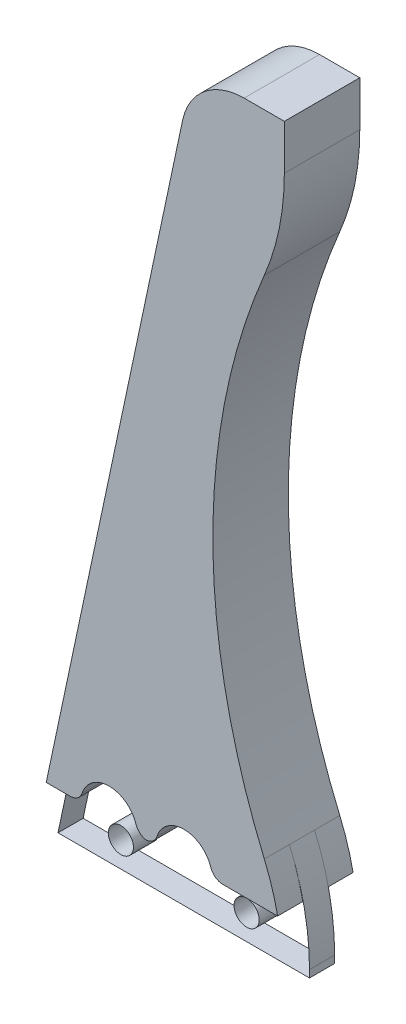
ISO-10303-21;
HEADER;
FILE_DESCRIPTION(('STEP AP214'),'2;1');
FILE_NAME('part.step','',(''),(''),'','','');
FILE_SCHEMA(('AUTOMOTIVE_DESIGN { 1 0 10303 214 1 1 1 1 }'));
ENDSEC;
DATA;
#1=APPLICATION_CONTEXT('core data for automotive mechanical design processes');
#2=APPLICATION_PROTOCOL_DEFINITION('international standard','automotive_design',2000,#1);
#3=PRODUCT_CONTEXT('',#1,'mechanical');
#4=PRODUCT('Part','Part','',(#3));
#5=PRODUCT_RELATED_PRODUCT_CATEGORY('part','',(#4));
#6=PRODUCT_DEFINITION_FORMATION('','',#4);
#7=PRODUCT_DEFINITION_CONTEXT('part definition',#1,'design');
#8=PRODUCT_DEFINITION('design','',#6,#7);
#9=PRODUCT_DEFINITION_SHAPE('','',#8);
#10=(LENGTH_UNIT() NAMED_UNIT(*) SI_UNIT(.MILLI.,.METRE.));
#11=(NAMED_UNIT(*) PLANE_ANGLE_UNIT() SI_UNIT($,.RADIAN.));
#12=(NAMED_UNIT(*) SI_UNIT($,.STERADIAN.) SOLID_ANGLE_UNIT());
#13=UNCERTAINTY_MEASURE_WITH_UNIT(LENGTH_MEASURE(1.E-05),#10,'distance_accuracy_value','');
#14=(GEOMETRIC_REPRESENTATION_CONTEXT(3) GLOBAL_UNCERTAINTY_ASSIGNED_CONTEXT((#13)) GLOBAL_UNIT_ASSIGNED_CONTEXT((#10,
#11,#12)) REPRESENTATION_CONTEXT('',''));
#15=CARTESIAN_POINT('',(0.,0.,0.));
#16=DIRECTION('',(0.,0.,1.));
#17=DIRECTION('',(1.,0.,0.));
#18=AXIS2_PLACEMENT_3D('',#15,#16,#17);
#19=CARTESIAN_POINT('',(1.06278280835009,5.,-2.));
#20=DIRECTION('',(0.,-1.,0.));
#21=DIRECTION('',(0.,0.,-1.));
#22=AXIS2_PLACEMENT_3D('',#19,#20,#21);
#23=PLANE('',#22);
#24=DIRECTION('',(1.,0.,0.));
#25=VECTOR('',#24,1.);
#26=CARTESIAN_POINT('',(1.06278280835009,5.,-2.));
#27=LINE('',#26,#25);
#28=CARTESIAN_POINT('',(1.06278280835009,5.,-2.));
#29=VERTEX_POINT('',#28);
#30=CARTESIAN_POINT('',(2.97045358913685,5.,-2.));
#31=VERTEX_POINT('',#30);
#32=EDGE_CURVE('E300',#29,#31,#27,.T.);
#33=ORIENTED_EDGE('',*,*,#32,.T.);
#34=DIRECTION('',(0.,0.,-1.));
#35=VECTOR('',#34,1.);
#36=CARTESIAN_POINT('',(2.97045358913685,5.,-2.));
#37=LINE('',#36,#35);
#38=CARTESIAN_POINT('',(2.97045358913685,5.,0.));
#39=VERTEX_POINT('',#38);
#40=EDGE_CURVE('E69',#31,#39,#37,.F.);
#41=ORIENTED_EDGE('',*,*,#40,.T.);
#42=DIRECTION('',(1.,0.,0.));
#43=VECTOR('',#42,1.);
#44=CARTESIAN_POINT('',(65.7262090119729,5.,0.));
#45=LINE('',#44,#43);
#46=CARTESIAN_POINT('',(1.06278280835009,5.,0.));
#47=VERTEX_POINT('',#46);
#48=EDGE_CURVE('E421',#47,#39,#45,.T.);
#49=ORIENTED_EDGE('',*,*,#48,.F.);
#50=DIRECTION('',(0.,0.,1.));
#51=VECTOR('',#50,1.);
#52=CARTESIAN_POINT('',(1.06278280835009,5.,-2.));
#53=LINE('',#52,#51);
#54=EDGE_CURVE('E243',#29,#47,#53,.T.);
#55=ORIENTED_EDGE('',*,*,#54,.F.);
#56=EDGE_LOOP('',(#33,#41,#49,#55));
#57=FACE_BOUND('',#56,.T.);
#58=ADVANCED_FACE('F45',(#57),#23,.T.);
#59=CARTESIAN_POINT('',(15.0851120275633,5.,0.));
#60=VERTEX_POINT('',#59);
#61=CARTESIAN_POINT('',(19.4673448233214,5.,0.));
#62=VERTEX_POINT('',#61);
#63=EDGE_CURVE('E420',#60,#62,#45,.T.);
#64=ORIENTED_EDGE('',*,*,#63,.F.);
#65=DIRECTION('',(0.,0.,-1.));
#66=VECTOR('',#65,1.);
#67=CARTESIAN_POINT('',(15.0851120275633,5.,-2.));
#68=LINE('',#67,#66);
#69=CARTESIAN_POINT('',(15.0851120275633,5.,-2.));
#70=VERTEX_POINT('',#69);
#71=EDGE_CURVE('E467',#60,#70,#68,.T.);
#72=ORIENTED_EDGE('',*,*,#71,.T.);
#73=CARTESIAN_POINT('',(19.4673448233214,5.,-2.));
#74=VERTEX_POINT('',#73);
#75=EDGE_CURVE('E299',#70,#74,#27,.T.);
#76=ORIENTED_EDGE('',*,*,#75,.T.);
#77=DIRECTION('',(0.,0.,1.));
#78=VECTOR('',#77,1.);
#79=CARTESIAN_POINT('',(19.4673448233214,5.,-2.));
#80=LINE('',#79,#78);
#81=EDGE_CURVE('E331',#74,#62,#80,.T.);
#82=ORIENTED_EDGE('',*,*,#81,.T.);
#83=EDGE_LOOP('',(#64,#72,#76,#82));
#84=FACE_BOUND('',#83,.T.);
#85=ADVANCED_FACE('F521',(#84),#23,.T.);
#86=DIRECTION('',(1.,0.,0.));
#87=VECTOR('',#86,1.);
#88=CARTESIAN_POINT('',(1.06278280835009,5.,4.));
#89=LINE('',#88,#87);
#90=CARTESIAN_POINT('',(15.1081120275633,5.,4.));
#91=VERTEX_POINT('',#90);
#92=CARTESIAN_POINT('',(19.4673448233214,5.,4.));
#93=VERTEX_POINT('',#92);
#94=EDGE_CURVE('E255',#91,#93,#89,.T.);
#95=ORIENTED_EDGE('',*,*,#94,.F.);
#96=DIRECTION('',(0.,0.,1.));
#97=VECTOR('',#96,1.);
#98=CARTESIAN_POINT('',(15.1081120275633,5.,-2.));
#99=LINE('',#98,#97);
#100=CARTESIAN_POINT('',(15.1081120275633,5.,2.));
#101=VERTEX_POINT('',#100);
#102=EDGE_CURVE('E444',#91,#101,#99,.F.);
#103=ORIENTED_EDGE('',*,*,#102,.T.);
#104=DIRECTION('',(1.,0.,0.));
#105=VECTOR('',#104,1.);
#106=CARTESIAN_POINT('',(65.7262090119729,5.,2.));
#107=LINE('',#106,#105);
#108=CARTESIAN_POINT('',(19.4673448233214,5.,2.));
#109=VERTEX_POINT('',#108);
#110=EDGE_CURVE('E345',#101,#109,#107,.T.);
#111=ORIENTED_EDGE('',*,*,#110,.T.);
#112=EDGE_CURVE('E334',#109,#93,#80,.T.);
#113=ORIENTED_EDGE('',*,*,#112,.T.);
#114=EDGE_LOOP('',(#95,#103,#111,#113));
#115=FACE_BOUND('',#114,.T.);
#116=ADVANCED_FACE('F617',(#115),#23,.T.);
#117=CARTESIAN_POINT('',(1.06278280835009,5.,2.));
#118=VERTEX_POINT('',#117);
#119=CARTESIAN_POINT('',(2.97045358913685,5.,2.));
#120=VERTEX_POINT('',#119);
#121=EDGE_CURVE('E346',#118,#120,#107,.T.);
#122=ORIENTED_EDGE('',*,*,#121,.T.);
#123=DIRECTION('',(0.,0.,1.));
#124=VECTOR('',#123,1.);
#125=CARTESIAN_POINT('',(2.97045358913685,5.,-2.));
#126=LINE('',#125,#124);
#127=CARTESIAN_POINT('',(2.97045358913685,5.,4.));
#128=VERTEX_POINT('',#127);
#129=EDGE_CURVE('E251',#120,#128,#126,.T.);
#130=ORIENTED_EDGE('',*,*,#129,.T.);
#131=CARTESIAN_POINT('',(1.06278280835009,5.,4.));
#132=VERTEX_POINT('',#131);
#133=EDGE_CURVE('E248',#132,#128,#89,.T.);
#134=ORIENTED_EDGE('',*,*,#133,.F.);
#135=EDGE_CURVE('E233',#118,#132,#53,.T.);
#136=ORIENTED_EDGE('',*,*,#135,.F.);
#137=EDGE_LOOP('',(#122,#130,#134,#136));
#138=FACE_BOUND('',#137,.T.);
#139=ADVANCED_FACE('F249',(#138),#23,.T.);
#140=CARTESIAN_POINT('',(0.,0.,2.));
#141=DIRECTION('',(0.978147600733806,-0.207911690817756,0.));
#142=DIRECTION('',(0.207911690817756,0.978147600733806,0.));
#143=AXIS2_PLACEMENT_3D('',#140,#141,#142);
#144=PLANE('',#143);
#145=DIRECTION('',(-0.207911690817756,-0.978147600733806,0.));
#146=VECTOR('',#145,1.);
#147=CARTESIAN_POINT('',(0.,0.,2.));
#148=LINE('',#147,#146);
#149=CARTESIAN_POINT('',(0.,0.,2.));
#150=VERTEX_POINT('',#149);
#151=EDGE_CURVE('E239',#118,#150,#148,.T.);
#152=ORIENTED_EDGE('',*,*,#151,.F.);
#153=ORIENTED_EDGE('',*,*,#135,.T.);
#154=DIRECTION('',(-0.207911690817756,-0.978147600733806,0.));
#155=VECTOR('',#154,1.);
#156=CARTESIAN_POINT('',(1.06278280835009,5.,4.));
#157=LINE('',#156,#155);
#158=CARTESIAN_POINT('',(11.9115758625071,56.0395584540888,4.));
#159=VERTEX_POINT('',#158);
#160=EDGE_CURVE('E237',#159,#132,#157,.T.);
#161=ORIENTED_EDGE('',*,*,#160,.F.);
#162=DIRECTION('',(0.,0.,-1.));
#163=VECTOR('',#162,1.);
#164=CARTESIAN_POINT('',(11.9115758625071,56.0395584540888,2.));
#165=LINE('',#164,#163);
#166=CARTESIAN_POINT('',(11.9115758625071,56.0395584540888,-2.));
#167=VERTEX_POINT('',#166);
#168=EDGE_CURVE('E395',#159,#167,#165,.T.);
#169=ORIENTED_EDGE('',*,*,#168,.T.);
#170=DIRECTION('',(-0.207911690817756,-0.978147600733806,0.));
#171=VECTOR('',#170,1.);
#172=CARTESIAN_POINT('',(1.06278280835009,5.,-2.));
#173=LINE('',#172,#171);
#174=EDGE_CURVE('E295',#167,#29,#173,.T.);
#175=ORIENTED_EDGE('',*,*,#174,.T.);
#176=ORIENTED_EDGE('',*,*,#54,.T.);
#177=DIRECTION('',(-0.207911690817756,-0.978147600733806,0.));
#178=VECTOR('',#177,1.);
#179=CARTESIAN_POINT('',(0.,0.,0.));
#180=LINE('',#179,#178);
#181=CARTESIAN_POINT('',(0.,0.,0.));
#182=VERTEX_POINT('',#181);
#183=EDGE_CURVE('E354',#47,#182,#180,.T.);
#184=ORIENTED_EDGE('',*,*,#183,.T.);
#185=DIRECTION('',(0.,0.,-1.));
#186=VECTOR('',#185,1.);
#187=CARTESIAN_POINT('',(0.,0.,2.));
#188=LINE('',#187,#186);
#189=EDGE_CURVE('E391',#150,#182,#188,.T.);
#190=ORIENTED_EDGE('',*,*,#189,.F.);
#191=EDGE_LOOP('',(#152,#153,#161,#169,#175,#176,#184,#190));
#192=FACE_BOUND('',#191,.T.);
#193=ADVANCED_FACE('F235',(#192),#144,.F.);
#194=CARTESIAN_POINT('',(0.,0.,2.));
#195=DIRECTION('',(0.,1.,0.));
#196=DIRECTION('',(0.,0.,1.));
#197=AXIS2_PLACEMENT_3D('',#194,#195,#196);
#198=PLANE('',#197);
#199=DIRECTION('',(1.,0.,0.));
#200=VECTOR('',#199,1.);
#201=CARTESIAN_POINT('',(0.,0.,0.));
#202=LINE('',#201,#200);
#203=CARTESIAN_POINT('',(20.,0.,0.));
#204=VERTEX_POINT('',#203);
#205=EDGE_CURVE('E379',#182,#204,#202,.T.);
#206=ORIENTED_EDGE('',*,*,#205,.T.);
#207=DIRECTION('',(0.,0.,-1.));
#208=VECTOR('',#207,1.);
#209=CARTESIAN_POINT('',(20.,0.,2.));
#210=LINE('',#209,#208);
#211=CARTESIAN_POINT('',(20.,0.,2.));
#212=VERTEX_POINT('',#211);
#213=EDGE_CURVE('E387',#212,#204,#210,.T.);
#214=ORIENTED_EDGE('',*,*,#213,.F.);
#215=DIRECTION('',(1.,0.,0.));
#216=VECTOR('',#215,1.);
#217=CARTESIAN_POINT('',(0.,0.,2.));
#218=LINE('',#217,#216);
#219=EDGE_CURVE('E368',#150,#212,#218,.T.);
#220=ORIENTED_EDGE('',*,*,#219,.F.);
#221=ORIENTED_EDGE('',*,*,#189,.T.);
#222=EDGE_LOOP('',(#206,#214,#220,#221));
#223=FACE_BOUND('',#222,.T.);
#224=ADVANCED_FACE('F554',(#223),#198,.F.);
#225=CARTESIAN_POINT('',(20.,0.,2.));
#226=DIRECTION('',(-1.,0.,0.));
#227=DIRECTION('',(0.,0.,1.));
#228=AXIS2_PLACEMENT_3D('',#225,#226,#227);
#229=PLANE('',#228);
#230=DIRECTION('',(0.,1.,0.));
#231=VECTOR('',#230,1.);
#232=CARTESIAN_POINT('',(20.,0.,0.));
#233=LINE('',#232,#231);
#234=CARTESIAN_POINT('',(20.,0.577620976898365,0.));
#235=VERTEX_POINT('',#234);
#236=EDGE_CURVE('E369',#204,#235,#233,.T.);
#237=ORIENTED_EDGE('',*,*,#236,.T.);
#238=DIRECTION('',(0.,0.,-1.));
#239=VECTOR('',#238,1.);
#240=CARTESIAN_POINT('',(20.,0.577620976898365,2.));
#241=LINE('',#240,#239);
#242=CARTESIAN_POINT('',(20.,0.577620976898365,2.));
#243=VERTEX_POINT('',#242);
#244=EDGE_CURVE('E414',#235,#243,#241,.F.);
#245=ORIENTED_EDGE('',*,*,#244,.T.);
#246=DIRECTION('',(0.,1.,0.));
#247=VECTOR('',#246,1.);
#248=CARTESIAN_POINT('',(20.,0.,2.));
#249=LINE('',#248,#247);
#250=EDGE_CURVE('E372',#212,#243,#249,.T.);
#251=ORIENTED_EDGE('',*,*,#250,.F.);
#252=ORIENTED_EDGE('',*,*,#213,.T.);
#253=EDGE_LOOP('',(#237,#245,#251,#252));
#254=FACE_BOUND('',#253,.T.);
#255=ADVANCED_FACE('F546',(#254),#229,.F.);
#256=CARTESIAN_POINT('',(65.7262090119729,28.5,2.));
#257=DIRECTION('',(0.,0.,-1.));
#258=DIRECTION('',(-1.,0.,0.));
#259=AXIS2_PLACEMENT_3D('',#256,#257,#258);
#260=CYLINDRICAL_SURFACE('',#259,51.4114402697166);
#261=DIRECTION('',(0.,0.,-1.));
#262=VECTOR('',#261,1.);
#263=CARTESIAN_POINT('',(18.4077533694123,48.6022373433818,2.));
#264=LINE('',#263,#262);
#265=CARTESIAN_POINT('',(18.4077533694123,48.6022373433818,-2.));
#266=VERTEX_POINT('',#265);
#267=CARTESIAN_POINT('',(18.4077533694123,48.6022373433818,4.));
#268=VERTEX_POINT('',#267);
#269=EDGE_CURVE('E404',#266,#268,#264,.F.);
#270=ORIENTED_EDGE('',*,*,#269,.T.);
#271=CARTESIAN_POINT('',(65.7262090119732,28.5,4.));
#272=DIRECTION('',(0.,0.,-1.));
#273=DIRECTION('',(1.,0.,0.));
#274=AXIS2_PLACEMENT_3D('',#271,#272,#273);
#275=CIRCLE('',#274,51.4114402697168);
#276=CARTESIAN_POINT('',(18.4077533694123,8.39776265661819,4.));
#277=VERTEX_POINT('',#276);
#278=EDGE_CURVE('E278',#277,#268,#275,.T.);
#279=ORIENTED_EDGE('',*,*,#278,.F.);
#280=DIRECTION('',(0.,0.,1.));
#281=VECTOR('',#280,1.);
#282=CARTESIAN_POINT('',(18.4077533694123,8.39776265661819,-2.));
#283=LINE('',#282,#281);
#284=CARTESIAN_POINT('',(18.4077533694123,8.39776265661818,2.));
#285=VERTEX_POINT('',#284);
#286=EDGE_CURVE('E330',#285,#277,#283,.T.);
#287=ORIENTED_EDGE('',*,*,#286,.F.);
#288=DIRECTION('',(0.,0.,-1.));
#289=VECTOR('',#288,1.);
#290=CARTESIAN_POINT('',(18.4077533694123,8.39776265661818,2.));
#291=LINE('',#290,#289);
#292=CARTESIAN_POINT('',(18.4077533694123,8.39776265661819,0.));
#293=VERTEX_POINT('',#292);
#294=EDGE_CURVE('E407',#285,#293,#291,.T.);
#295=ORIENTED_EDGE('',*,*,#294,.T.);
#296=CARTESIAN_POINT('',(18.4077533694123,8.39776265661819,-2.));
#297=VERTEX_POINT('',#296);
#298=EDGE_CURVE('E326',#297,#293,#283,.T.);
#299=ORIENTED_EDGE('',*,*,#298,.F.);
#300=CARTESIAN_POINT('',(65.7262090119732,28.5,-2.));
#301=DIRECTION('',(0.,0.,-1.));
#302=DIRECTION('',(1.,0.,0.));
#303=AXIS2_PLACEMENT_3D('',#300,#301,#302);
#304=CIRCLE('',#303,51.4114402697168);
#305=EDGE_CURVE('E307',#297,#266,#304,.T.);
#306=ORIENTED_EDGE('',*,*,#305,.T.);
#307=EDGE_LOOP('',(#270,#279,#287,#295,#299,#306));
#308=FACE_BOUND('',#307,.T.);
#309=ADVANCED_FACE('F533',(#308),#260,.F.);
#310=CARTESIAN_POINT('',(20.,60.,2.));
#311=DIRECTION('',(-1.,0.,0.));
#312=DIRECTION('',(0.,-1.,0.));
#313=AXIS2_PLACEMENT_3D('',#310,#311,#312);
#314=PLANE('',#313);
#315=DIRECTION('',(0.,0.,-1.));
#316=VECTOR('',#315,1.);
#317=CARTESIAN_POINT('',(20.,60.,2.));
#318=LINE('',#317,#316);
#319=CARTESIAN_POINT('',(20.,60.,4.));
#320=VERTEX_POINT('',#319);
#321=CARTESIAN_POINT('',(20.,60.,-2.));
#322=VERTEX_POINT('',#321);
#323=EDGE_CURVE('E376',#320,#322,#318,.T.);
#324=ORIENTED_EDGE('',*,*,#323,.F.);
#325=DIRECTION('',(0.,1.,0.));
#326=VECTOR('',#325,1.);
#327=CARTESIAN_POINT('',(20.,60.,4.));
#328=LINE('',#327,#326);
#329=CARTESIAN_POINT('',(20.,56.4223790231016,4.));
#330=VERTEX_POINT('',#329);
#331=EDGE_CURVE('E286',#330,#320,#328,.T.);
#332=ORIENTED_EDGE('',*,*,#331,.F.);
#333=DIRECTION('',(0.,0.,-1.));
#334=VECTOR('',#333,1.);
#335=CARTESIAN_POINT('',(20.,56.4223790231016,2.));
#336=LINE('',#335,#334);
#337=CARTESIAN_POINT('',(20.,56.4223790231016,-2.));
#338=VERTEX_POINT('',#337);
#339=EDGE_CURVE('E401',#330,#338,#336,.T.);
#340=ORIENTED_EDGE('',*,*,#339,.T.);
#341=DIRECTION('',(0.,1.,0.));
#342=VECTOR('',#341,1.);
#343=CARTESIAN_POINT('',(20.,60.,-2.));
#344=LINE('',#343,#342);
#345=EDGE_CURVE('E315',#338,#322,#344,.T.);
#346=ORIENTED_EDGE('',*,*,#345,.T.);
#347=EDGE_LOOP('',(#324,#332,#340,#346));
#348=FACE_BOUND('',#347,.T.);
#349=ADVANCED_FACE('F627',(#348),#314,.F.);
#350=CARTESIAN_POINT('',(12.7533937002011,60.,2.));
#351=DIRECTION('',(0.,-1.,0.));
#352=DIRECTION('',(0.,0.,-1.));
#353=AXIS2_PLACEMENT_3D('',#350,#351,#352);
#354=PLANE('',#353);
#355=ORIENTED_EDGE('',*,*,#323,.T.);
#356=DIRECTION('',(-1.,0.,0.));
#357=VECTOR('',#356,1.);
#358=CARTESIAN_POINT('',(16.8023138661762,60.,-2.));
#359=LINE('',#358,#357);
#360=CARTESIAN_POINT('',(16.8023138661762,60.,-2.));
#361=VERTEX_POINT('',#360);
#362=EDGE_CURVE('E319',#322,#361,#359,.T.);
#363=ORIENTED_EDGE('',*,*,#362,.T.);
#364=DIRECTION('',(0.,0.,-1.));
#365=VECTOR('',#364,1.);
#366=CARTESIAN_POINT('',(16.8023138661762,60.,2.));
#367=LINE('',#366,#365);
#368=CARTESIAN_POINT('',(16.8023138661762,60.,4.));
#369=VERTEX_POINT('',#368);
#370=EDGE_CURVE('E398',#361,#369,#367,.F.);
#371=ORIENTED_EDGE('',*,*,#370,.T.);
#372=DIRECTION('',(-1.,0.,0.));
#373=VECTOR('',#372,1.);
#374=CARTESIAN_POINT('',(16.8023138661762,60.,4.));
#375=LINE('',#374,#373);
#376=EDGE_CURVE('E290',#320,#369,#375,.T.);
#377=ORIENTED_EDGE('',*,*,#376,.F.);
#378=EDGE_LOOP('',(#355,#363,#371,#377));
#379=FACE_BOUND('',#378,.T.);
#380=ADVANCED_FACE('F630',(#379),#354,.F.);
#381=CARTESIAN_POINT('',(65.7262090119729,28.5,2.));
#382=DIRECTION('',(0.,0.,1.));
#383=DIRECTION('',(1.,0.,0.));
#384=AXIS2_PLACEMENT_3D('',#381,#382,#383);
#385=PLANE('',#384);
#386=CARTESIAN_POINT('',(1.90823451446642,1.38829373863014,2.));
#387=DIRECTION('',(0.,0.,1.));
#388=DIRECTION('',(1.,0.,0.));
#389=AXIS2_PLACEMENT_3D('',#386,#387,#388);
#390=CIRCLE('',#389,17.9267056917035);
#391=EDGE_CURVE('E341',#109,#285,#390,.T.);
#392=ORIENTED_EDGE('',*,*,#391,.F.);
#393=ORIENTED_EDGE('',*,*,#110,.F.);
#394=CARTESIAN_POINT('',(15.1081120275633,6.,2.));
#395=DIRECTION('',(0.,0.,1.));
#396=DIRECTION('',(1.,0.,0.));
#397=AXIS2_PLACEMENT_3D('',#394,#395,#396);
#398=CIRCLE('',#397,1.);
#399=CARTESIAN_POINT('',(14.1566261139593,5.69230769230769,2.));
#400=VERTEX_POINT('',#399);
#401=EDGE_CURVE('E455',#101,#400,#398,.F.);
#402=ORIENTED_EDGE('',*,*,#401,.T.);
#403=CARTESIAN_POINT('',(12.0157828083501,5.,2.));
#404=DIRECTION('',(0.,0.,-1.));
#405=DIRECTION('',(-1.,0.,0.));
#406=AXIS2_PLACEMENT_3D('',#403,#404,#405);
#407=CIRCLE('',#406,2.25);
#408=CARTESIAN_POINT('',(9.87493950274092,5.69230769230769,2.));
#409=VERTEX_POINT('',#408);
#410=EDGE_CURVE('E264',#409,#400,#407,.T.);
#411=ORIENTED_EDGE('',*,*,#410,.F.);
#412=CARTESIAN_POINT('',(8.92345358913685,6.,2.));
#413=DIRECTION('',(0.,0.,1.));
#414=DIRECTION('',(1.,0.,0.));
#415=AXIS2_PLACEMENT_3D('',#412,#413,#414);
#416=CIRCLE('',#415,1.);
#417=CARTESIAN_POINT('',(9.03928280835009,5.00673085622453,2.));
#418=VERTEX_POINT('',#417);
#419=EDGE_CURVE('E461',#409,#418,#416,.F.);
#420=ORIENTED_EDGE('',*,*,#419,.T.);
#421=CARTESIAN_POINT('',(9.15511202756334,6.,2.));
#422=DIRECTION('',(0.,0.,1.));
#423=DIRECTION('',(1.,0.,0.));
#424=AXIS2_PLACEMENT_3D('',#421,#422,#423);
#425=CIRCLE('',#424,1.);
#426=CARTESIAN_POINT('',(8.20362611395926,5.69230769230769,2.));
#427=VERTEX_POINT('',#426);
#428=EDGE_CURVE('E464',#418,#427,#425,.F.);
#429=ORIENTED_EDGE('',*,*,#428,.T.);
#430=CARTESIAN_POINT('',(6.06278280835009,5.,2.));
#431=DIRECTION('',(0.,0.,-1.));
#432=DIRECTION('',(-1.,0.,0.));
#433=AXIS2_PLACEMENT_3D('',#430,#431,#432);
#434=CIRCLE('',#433,2.25);
#435=CARTESIAN_POINT('',(3.92193950274092,5.69230769230769,2.));
#436=VERTEX_POINT('',#435);
#437=EDGE_CURVE('E272',#436,#427,#434,.T.);
#438=ORIENTED_EDGE('',*,*,#437,.F.);
#439=CARTESIAN_POINT('',(2.97045358913685,6.,2.));
#440=DIRECTION('',(0.,0.,1.));
#441=DIRECTION('',(1.,0.,0.));
#442=AXIS2_PLACEMENT_3D('',#439,#440,#441);
#443=CIRCLE('',#442,1.);
#444=EDGE_CURVE('E458',#436,#120,#443,.F.);
#445=ORIENTED_EDGE('',*,*,#444,.T.);
#446=ORIENTED_EDGE('',*,*,#121,.F.);
#447=ORIENTED_EDGE('',*,*,#151,.T.);
#448=ORIENTED_EDGE('',*,*,#219,.T.);
#449=ORIENTED_EDGE('',*,*,#250,.T.);
#450=CARTESIAN_POINT('',(0.,0.577620976898365,2.));
#451=DIRECTION('',(0.,0.,1.));
#452=DIRECTION('',(1.,0.,0.));
#453=AXIS2_PLACEMENT_3D('',#450,#451,#452);
#454=CIRCLE('',#453,20.);
#455=EDGE_CURVE('E417',#243,#285,#454,.T.);
#456=ORIENTED_EDGE('',*,*,#455,.T.);
#457=EDGE_LOOP('',(#392,#393,#402,#411,#420,#429,#438,#445,#446,#447,#448,#449,#456));
#458=FACE_BOUND('',#457,.T.);
#459=CARTESIAN_POINT('',(5.,2.,2.));
#460=DIRECTION('',(0.,0.,1.));
#461=DIRECTION('',(1.,0.,0.));
#462=AXIS2_PLACEMENT_3D('',#459,#460,#461);
#463=CIRCLE('',#462,1.);
#464=CARTESIAN_POINT('',(6.,2.,2.));
#465=VERTEX_POINT('',#464);
#466=EDGE_CURVE('E355',#465,#465,#463,.T.);
#467=ORIENTED_EDGE('',*,*,#466,.F.);
#468=EDGE_LOOP('',(#467));
#469=FACE_BOUND('',#468,.T.);
#470=CARTESIAN_POINT('',(15.,2.,2.));
#471=DIRECTION('',(0.,0.,1.));
#472=DIRECTION('',(1.,0.,0.));
#473=AXIS2_PLACEMENT_3D('',#470,#471,#472);
#474=CIRCLE('',#473,1.);
#475=CARTESIAN_POINT('',(16.,2.,2.));
#476=VERTEX_POINT('',#475);
#477=EDGE_CURVE('E359',#476,#476,#474,.T.);
#478=ORIENTED_EDGE('',*,*,#477,.F.);
#479=EDGE_LOOP('',(#478));
#480=FACE_BOUND('',#479,.T.);
#481=ADVANCED_FACE('F549',(#458,#469,#480),#385,.T.);
#482=CARTESIAN_POINT('',(65.7262090119729,28.5,0.));
#483=DIRECTION('',(0.,0.,1.));
#484=DIRECTION('',(1.,0.,0.));
#485=AXIS2_PLACEMENT_3D('',#482,#483,#484);
#486=PLANE('',#485);
#487=CARTESIAN_POINT('',(5.,2.,0.));
#488=DIRECTION('',(0.,0.,1.));
#489=DIRECTION('',(1.,0.,0.));
#490=AXIS2_PLACEMENT_3D('',#487,#488,#489);
#491=CIRCLE('',#490,1.);
#492=CARTESIAN_POINT('',(6.,2.,0.));
#493=VERTEX_POINT('',#492);
#494=EDGE_CURVE('E350',#493,#493,#491,.T.);
#495=ORIENTED_EDGE('',*,*,#494,.T.);
#496=EDGE_LOOP('',(#495));
#497=FACE_BOUND('',#496,.T.);
#498=CARTESIAN_POINT('',(15.,2.,0.));
#499=DIRECTION('',(0.,0.,1.));
#500=DIRECTION('',(1.,0.,0.));
#501=AXIS2_PLACEMENT_3D('',#498,#499,#500);
#502=CIRCLE('',#501,1.);
#503=CARTESIAN_POINT('',(16.,2.,0.));
#504=VERTEX_POINT('',#503);
#505=EDGE_CURVE('E349',#504,#504,#502,.T.);
#506=ORIENTED_EDGE('',*,*,#505,.T.);
#507=EDGE_LOOP('',(#506));
#508=FACE_BOUND('',#507,.T.);
#509=ORIENTED_EDGE('',*,*,#48,.T.);
#510=CARTESIAN_POINT('',(2.97045358913685,6.,0.));
#511=DIRECTION('',(0.,0.,1.));
#512=DIRECTION('',(1.,0.,0.));
#513=AXIS2_PLACEMENT_3D('',#510,#511,#512);
#514=CIRCLE('',#513,1.);
#515=CARTESIAN_POINT('',(3.92193950274092,5.69230769230769,0.));
#516=VERTEX_POINT('',#515);
#517=EDGE_CURVE('E11',#39,#516,#514,.T.);
#518=ORIENTED_EDGE('',*,*,#517,.T.);
#519=CARTESIAN_POINT('',(6.06278280835009,5.,0.));
#520=DIRECTION('',(0.,0.,1.));
#521=DIRECTION('',(1.,0.,0.));
#522=AXIS2_PLACEMENT_3D('',#519,#520,#521);
#523=CIRCLE('',#522,2.25);
#524=CARTESIAN_POINT('',(8.20362611395926,5.69230769230769,0.));
#525=VERTEX_POINT('',#524);
#526=EDGE_CURVE('E472',#525,#516,#523,.T.);
#527=ORIENTED_EDGE('',*,*,#526,.F.);
#528=CARTESIAN_POINT('',(9.15511202756334,6.,0.));
#529=DIRECTION('',(0.,0.,1.));
#530=DIRECTION('',(1.,0.,0.));
#531=AXIS2_PLACEMENT_3D('',#528,#529,#530);
#532=CIRCLE('',#531,1.);
#533=CARTESIAN_POINT('',(9.0277828083501,5.00813949068705,0.));
#534=VERTEX_POINT('',#533);
#535=EDGE_CURVE('E55',#525,#534,#532,.T.);
#536=ORIENTED_EDGE('',*,*,#535,.T.);
#537=CARTESIAN_POINT('',(8.90045358913686,6.,0.));
#538=DIRECTION('',(0.,0.,1.));
#539=DIRECTION('',(1.,0.,0.));
#540=AXIS2_PLACEMENT_3D('',#537,#538,#539);
#541=CIRCLE('',#540,1.);
#542=CARTESIAN_POINT('',(9.85193950274093,5.69230769230768,0.));
#543=VERTEX_POINT('',#542);
#544=EDGE_CURVE('E507',#534,#543,#541,.T.);
#545=ORIENTED_EDGE('',*,*,#544,.T.);
#546=CARTESIAN_POINT('',(11.9927828083501,4.99999999999996,0.));
#547=DIRECTION('',(0.,0.,1.));
#548=DIRECTION('',(1.,0.,0.));
#549=AXIS2_PLACEMENT_3D('',#546,#547,#548);
#550=CIRCLE('',#549,2.25);
#551=CARTESIAN_POINT('',(14.1336261139593,5.69230769230768,0.));
#552=VERTEX_POINT('',#551);
#553=EDGE_CURVE('E579',#552,#543,#550,.T.);
#554=ORIENTED_EDGE('',*,*,#553,.F.);
#555=CARTESIAN_POINT('',(15.0851120275633,6.,0.));
#556=DIRECTION('',(0.,0.,1.));
#557=DIRECTION('',(1.,0.,0.));
#558=AXIS2_PLACEMENT_3D('',#555,#556,#557);
#559=CIRCLE('',#558,1.);
#560=EDGE_CURVE('E504',#552,#60,#559,.T.);
#561=ORIENTED_EDGE('',*,*,#560,.T.);
#562=ORIENTED_EDGE('',*,*,#63,.T.);
#563=CARTESIAN_POINT('',(1.90823451446642,1.38829373863014,0.));
#564=DIRECTION('',(0.,0.,1.));
#565=DIRECTION('',(1.,0.,0.));
#566=AXIS2_PLACEMENT_3D('',#563,#564,#565);
#567=CIRCLE('',#566,17.9267056917035);
#568=EDGE_CURVE('E329',#62,#293,#567,.T.);
#569=ORIENTED_EDGE('',*,*,#568,.T.);
#570=CARTESIAN_POINT('',(0.,0.577620976898365,0.));
#571=DIRECTION('',(0.,0.,1.));
#572=DIRECTION('',(1.,0.,0.));
#573=AXIS2_PLACEMENT_3D('',#570,#571,#572);
#574=CIRCLE('',#573,20.);
#575=EDGE_CURVE('E411',#293,#235,#574,.F.);
#576=ORIENTED_EDGE('',*,*,#575,.T.);
#577=ORIENTED_EDGE('',*,*,#236,.F.);
#578=ORIENTED_EDGE('',*,*,#205,.F.);
#579=ORIENTED_EDGE('',*,*,#183,.F.);
#580=EDGE_LOOP('',(#509,#518,#527,#536,#545,#554,#561,#562,#569,#576,#577,#578,#579));
#581=FACE_BOUND('',#580,.T.);
#582=ADVANCED_FACE('F538',(#497,#508,#581),#486,.F.);
#583=CARTESIAN_POINT('',(16.8023138661762,55.,2.));
#584=DIRECTION('',(0.,0.,-1.));
#585=DIRECTION('',(-1.,0.,0.));
#586=AXIS2_PLACEMENT_3D('',#583,#584,#585);
#587=CYLINDRICAL_SURFACE('',#586,5.);
#588=ORIENTED_EDGE('',*,*,#168,.F.);
#589=CARTESIAN_POINT('',(16.8023138661762,55.,4.));
#590=DIRECTION('',(0.,0.,1.));
#591=DIRECTION('',(-1.,0.,0.));
#592=AXIS2_PLACEMENT_3D('',#589,#590,#591);
#593=CIRCLE('',#592,5.);
#594=EDGE_CURVE('E262',#369,#159,#593,.T.);
#595=ORIENTED_EDGE('',*,*,#594,.F.);
#596=ORIENTED_EDGE('',*,*,#370,.F.);
#597=CARTESIAN_POINT('',(16.8023138661762,55.,-2.));
#598=DIRECTION('',(0.,0.,1.));
#599=DIRECTION('',(-1.,0.,0.));
#600=AXIS2_PLACEMENT_3D('',#597,#598,#599);
#601=CIRCLE('',#600,5.);
#602=EDGE_CURVE('E244',#361,#167,#601,.T.);
#603=ORIENTED_EDGE('',*,*,#602,.T.);
#604=EDGE_LOOP('',(#588,#595,#596,#603));
#605=FACE_BOUND('',#604,.T.);
#606=ADVANCED_FACE('F633',(#605),#587,.T.);
#607=CARTESIAN_POINT('',(0.,56.4223790231016,2.));
#608=DIRECTION('',(0.,0.,-1.));
#609=DIRECTION('',(-1.,0.,0.));
#610=AXIS2_PLACEMENT_3D('',#607,#608,#609);
#611=CYLINDRICAL_SURFACE('',#610,20.);
#612=ORIENTED_EDGE('',*,*,#339,.F.);
#613=CARTESIAN_POINT('',(-6.17561557447743E-13,56.4223790231017,4.));
#614=DIRECTION('',(0.,0.,1.));
#615=DIRECTION('',(-1.,0.,0.));
#616=AXIS2_PLACEMENT_3D('',#613,#614,#615);
#617=CIRCLE('',#616,20.0000000000006);
#618=EDGE_CURVE('E282',#268,#330,#617,.T.);
#619=ORIENTED_EDGE('',*,*,#618,.F.);
#620=ORIENTED_EDGE('',*,*,#269,.F.);
#621=CARTESIAN_POINT('',(-6.17561557447743E-13,56.4223790231017,-2.));
#622=DIRECTION('',(0.,0.,1.));
#623=DIRECTION('',(-1.,0.,0.));
#624=AXIS2_PLACEMENT_3D('',#621,#622,#623);
#625=CIRCLE('',#624,20.0000000000006);
#626=EDGE_CURVE('E311',#266,#338,#625,.T.);
#627=ORIENTED_EDGE('',*,*,#626,.T.);
#628=EDGE_LOOP('',(#612,#619,#620,#627));
#629=FACE_BOUND('',#628,.T.);
#630=ADVANCED_FACE('F625',(#629),#611,.T.);
#631=CARTESIAN_POINT('',(0.,0.577620976898365,2.));
#632=DIRECTION('',(0.,0.,-1.));
#633=DIRECTION('',(-1.,0.,0.));
#634=AXIS2_PLACEMENT_3D('',#631,#632,#633);
#635=CYLINDRICAL_SURFACE('',#634,20.);
#636=ORIENTED_EDGE('',*,*,#455,.F.);
#637=ORIENTED_EDGE('',*,*,#244,.F.);
#638=ORIENTED_EDGE('',*,*,#575,.F.);
#639=ORIENTED_EDGE('',*,*,#294,.F.);
#640=EDGE_LOOP('',(#636,#637,#638,#639));
#641=FACE_BOUND('',#640,.T.);
#642=ADVANCED_FACE('F543',(#641),#635,.T.);
#643=CARTESIAN_POINT('',(15.,2.,0.));
#644=DIRECTION('',(0.,0.,1.));
#645=DIRECTION('',(1.,0.,0.));
#646=AXIS2_PLACEMENT_3D('',#643,#644,#645);
#647=CYLINDRICAL_SURFACE('',#646,1.);
#648=ORIENTED_EDGE('',*,*,#505,.F.);
#649=EDGE_LOOP('',(#648));
#650=FACE_BOUND('',#649,.T.);
#651=ORIENTED_EDGE('',*,*,#477,.T.);
#652=EDGE_LOOP('',(#651));
#653=FACE_BOUND('',#652,.T.);
#654=ADVANCED_FACE('F676',(#650,#653),#647,.F.);
#655=CARTESIAN_POINT('',(5.,2.,0.));
#656=DIRECTION('',(0.,0.,1.));
#657=DIRECTION('',(1.,0.,0.));
#658=AXIS2_PLACEMENT_3D('',#655,#656,#657);
#659=CYLINDRICAL_SURFACE('',#658,1.);
#660=ORIENTED_EDGE('',*,*,#494,.F.);
#661=EDGE_LOOP('',(#660));
#662=FACE_BOUND('',#661,.T.);
#663=ORIENTED_EDGE('',*,*,#466,.T.);
#664=EDGE_LOOP('',(#663));
#665=FACE_BOUND('',#664,.T.);
#666=ADVANCED_FACE('F678',(#662,#665),#659,.F.);
#667=CARTESIAN_POINT('',(16.8023138661762,55.,-2.));
#668=DIRECTION('',(0.,0.,-1.));
#669=DIRECTION('',(-1.,0.,0.));
#670=AXIS2_PLACEMENT_3D('',#667,#668,#669);
#671=PLANE('',#670);
#672=ORIENTED_EDGE('',*,*,#75,.F.);
#673=CARTESIAN_POINT('',(15.0851120275633,6.,-2.));
#674=DIRECTION('',(0.,0.,-1.));
#675=DIRECTION('',(-1.,0.,0.));
#676=AXIS2_PLACEMENT_3D('',#673,#674,#675);
#677=CIRCLE('',#676,1.);
#678=CARTESIAN_POINT('',(14.1336261139593,5.69230769230768,-2.));
#679=VERTEX_POINT('',#678);
#680=EDGE_CURVE('E485',#70,#679,#677,.T.);
#681=ORIENTED_EDGE('',*,*,#680,.T.);
#682=CARTESIAN_POINT('',(11.9927828083501,4.99999999999996,-2.));
#683=DIRECTION('',(0.,0.,1.));
#684=DIRECTION('',(1.,0.,0.));
#685=AXIS2_PLACEMENT_3D('',#682,#683,#684);
#686=CIRCLE('',#685,2.25);
#687=CARTESIAN_POINT('',(9.85193950274093,5.69230769230768,-2.));
#688=VERTEX_POINT('',#687);
#689=EDGE_CURVE('E573',#679,#688,#686,.T.);
#690=ORIENTED_EDGE('',*,*,#689,.T.);
#691=CARTESIAN_POINT('',(8.90045358913686,6.,-2.));
#692=DIRECTION('',(0.,0.,-1.));
#693=DIRECTION('',(-1.,0.,0.));
#694=AXIS2_PLACEMENT_3D('',#691,#692,#693);
#695=CIRCLE('',#694,1.);
#696=CARTESIAN_POINT('',(9.0277828083501,5.00813949068705,-2.));
#697=VERTEX_POINT('',#696);
#698=EDGE_CURVE('E482',#688,#697,#695,.T.);
#699=ORIENTED_EDGE('',*,*,#698,.T.);
#700=CARTESIAN_POINT('',(9.15511202756334,6.,-2.));
#701=DIRECTION('',(0.,0.,-1.));
#702=DIRECTION('',(-1.,0.,0.));
#703=AXIS2_PLACEMENT_3D('',#700,#701,#702);
#704=CIRCLE('',#703,1.);
#705=CARTESIAN_POINT('',(8.20362611395926,5.69230769230769,-2.));
#706=VERTEX_POINT('',#705);
#707=EDGE_CURVE('E479',#697,#706,#704,.T.);
#708=ORIENTED_EDGE('',*,*,#707,.T.);
#709=CARTESIAN_POINT('',(6.06278280835009,5.,-2.));
#710=DIRECTION('',(0.,0.,1.));
#711=DIRECTION('',(1.,0.,0.));
#712=AXIS2_PLACEMENT_3D('',#709,#710,#711);
#713=CIRCLE('',#712,2.25);
#714=CARTESIAN_POINT('',(3.92193950274092,5.69230769230769,-2.));
#715=VERTEX_POINT('',#714);
#716=EDGE_CURVE('E562',#706,#715,#713,.T.);
#717=ORIENTED_EDGE('',*,*,#716,.T.);
#718=CARTESIAN_POINT('',(2.97045358913685,6.,-2.));
#719=DIRECTION('',(0.,0.,-1.));
#720=DIRECTION('',(-1.,0.,0.));
#721=AXIS2_PLACEMENT_3D('',#718,#719,#720);
#722=CIRCLE('',#721,1.);
#723=EDGE_CURVE('E476',#715,#31,#722,.T.);
#724=ORIENTED_EDGE('',*,*,#723,.T.);
#725=ORIENTED_EDGE('',*,*,#32,.F.);
#726=ORIENTED_EDGE('',*,*,#174,.F.);
#727=ORIENTED_EDGE('',*,*,#602,.F.);
#728=ORIENTED_EDGE('',*,*,#362,.F.);
#729=ORIENTED_EDGE('',*,*,#345,.F.);
#730=ORIENTED_EDGE('',*,*,#626,.F.);
#731=ORIENTED_EDGE('',*,*,#305,.F.);
#732=CARTESIAN_POINT('',(1.90823451446642,1.38829373863014,-2.));
#733=DIRECTION('',(0.,0.,1.));
#734=DIRECTION('',(-1.,0.,0.));
#735=AXIS2_PLACEMENT_3D('',#732,#733,#734);
#736=CIRCLE('',#735,17.9267056917035);
#737=EDGE_CURVE('E303',#74,#297,#736,.T.);
#738=ORIENTED_EDGE('',*,*,#737,.F.);
#739=EDGE_LOOP('',(#672,#681,#690,#699,#708,#717,#724,#725,#726,#727,#728,#729,#730,#731,#738));
#740=FACE_BOUND('',#739,.T.);
#741=ADVANCED_FACE('F529',(#740),#671,.T.);
#742=CARTESIAN_POINT('',(1.90823451446642,1.38829373863014,-2.));
#743=DIRECTION('',(0.,0.,1.));
#744=DIRECTION('',(1.,0.,0.));
#745=AXIS2_PLACEMENT_3D('',#742,#743,#744);
#746=CYLINDRICAL_SURFACE('',#745,17.9267056917035);
#747=ORIENTED_EDGE('',*,*,#568,.F.);
#748=ORIENTED_EDGE('',*,*,#81,.F.);
#749=ORIENTED_EDGE('',*,*,#737,.T.);
#750=ORIENTED_EDGE('',*,*,#298,.T.);
#751=EDGE_LOOP('',(#747,#748,#749,#750));
#752=FACE_BOUND('',#751,.T.);
#753=ADVANCED_FACE('F527',(#752),#746,.T.);
#754=ORIENTED_EDGE('',*,*,#112,.F.);
#755=ORIENTED_EDGE('',*,*,#391,.T.);
#756=ORIENTED_EDGE('',*,*,#286,.T.);
#757=CARTESIAN_POINT('',(1.90823451446642,1.38829373863014,4.));
#758=DIRECTION('',(0.,0.,1.));
#759=DIRECTION('',(-1.,0.,0.));
#760=AXIS2_PLACEMENT_3D('',#757,#758,#759);
#761=CIRCLE('',#760,17.9267056917035);
#762=EDGE_CURVE('E254',#93,#277,#761,.T.);
#763=ORIENTED_EDGE('',*,*,#762,.F.);
#764=EDGE_LOOP('',(#754,#755,#756,#763));
#765=FACE_BOUND('',#764,.T.);
#766=ADVANCED_FACE('F621',(#765),#746,.T.);
#767=CARTESIAN_POINT('',(16.8023138661762,55.,4.));
#768=DIRECTION('',(0.,0.,-1.));
#769=DIRECTION('',(-1.,0.,0.));
#770=AXIS2_PLACEMENT_3D('',#767,#768,#769);
#771=PLANE('',#770);
#772=CARTESIAN_POINT('',(12.0157828083501,5.,4.));
#773=DIRECTION('',(0.,0.,-1.));
#774=DIRECTION('',(-1.,0.,0.));
#775=AXIS2_PLACEMENT_3D('',#772,#773,#774);
#776=CIRCLE('',#775,2.25);
#777=CARTESIAN_POINT('',(9.87493950274092,5.69230769230769,4.));
#778=VERTEX_POINT('',#777);
#779=CARTESIAN_POINT('',(14.1566261139593,5.69230769230769,4.));
#780=VERTEX_POINT('',#779);
#781=EDGE_CURVE('E269',#778,#780,#776,.T.);
#782=ORIENTED_EDGE('',*,*,#781,.T.);
#783=CARTESIAN_POINT('',(15.1081120275633,6.,4.));
#784=DIRECTION('',(0.,0.,-1.));
#785=DIRECTION('',(-1.,0.,0.));
#786=AXIS2_PLACEMENT_3D('',#783,#784,#785);
#787=CIRCLE('',#786,1.);
#788=EDGE_CURVE('E441',#780,#91,#787,.F.);
#789=ORIENTED_EDGE('',*,*,#788,.T.);
#790=ORIENTED_EDGE('',*,*,#94,.T.);
#791=ORIENTED_EDGE('',*,*,#762,.T.);
#792=ORIENTED_EDGE('',*,*,#278,.T.);
#793=ORIENTED_EDGE('',*,*,#618,.T.);
#794=ORIENTED_EDGE('',*,*,#331,.T.);
#795=ORIENTED_EDGE('',*,*,#376,.T.);
#796=ORIENTED_EDGE('',*,*,#594,.T.);
#797=ORIENTED_EDGE('',*,*,#160,.T.);
#798=ORIENTED_EDGE('',*,*,#133,.T.);
#799=CARTESIAN_POINT('',(2.97045358913685,6.,4.));
#800=DIRECTION('',(0.,0.,-1.));
#801=DIRECTION('',(-1.,0.,0.));
#802=AXIS2_PLACEMENT_3D('',#799,#800,#801);
#803=CIRCLE('',#802,1.);
#804=CARTESIAN_POINT('',(3.92193950274092,5.69230769230769,4.));
#805=VERTEX_POINT('',#804);
#806=EDGE_CURVE('E438',#128,#805,#803,.F.);
#807=ORIENTED_EDGE('',*,*,#806,.T.);
#808=CARTESIAN_POINT('',(6.06278280835009,5.,4.));
#809=DIRECTION('',(0.,0.,-1.));
#810=DIRECTION('',(-1.,0.,0.));
#811=AXIS2_PLACEMENT_3D('',#808,#809,#810);
#812=CIRCLE('',#811,2.25);
#813=CARTESIAN_POINT('',(8.20362611395926,5.69230769230769,4.));
#814=VERTEX_POINT('',#813);
#815=EDGE_CURVE('E584',#805,#814,#812,.T.);
#816=ORIENTED_EDGE('',*,*,#815,.T.);
#817=CARTESIAN_POINT('',(9.15511202756334,6.,4.));
#818=DIRECTION('',(0.,0.,-1.));
#819=DIRECTION('',(-1.,0.,0.));
#820=AXIS2_PLACEMENT_3D('',#817,#818,#819);
#821=CIRCLE('',#820,1.);
#822=CARTESIAN_POINT('',(9.03928280835009,5.00673085622453,4.));
#823=VERTEX_POINT('',#822);
#824=EDGE_CURVE('E432',#814,#823,#821,.F.);
#825=ORIENTED_EDGE('',*,*,#824,.T.);
#826=CARTESIAN_POINT('',(8.92345358913685,6.,4.));
#827=DIRECTION('',(0.,0.,-1.));
#828=DIRECTION('',(-1.,0.,0.));
#829=AXIS2_PLACEMENT_3D('',#826,#827,#828);
#830=CIRCLE('',#829,1.);
#831=EDGE_CURVE('E435',#823,#778,#830,.F.);
#832=ORIENTED_EDGE('',*,*,#831,.T.);
#833=EDGE_LOOP('',(#782,#789,#790,#791,#792,#793,#794,#795,#796,#797,#798,#807,#816,#825,#832));
#834=FACE_BOUND('',#833,.T.);
#835=ADVANCED_FACE('F259',(#834),#771,.F.);
#836=CARTESIAN_POINT('',(6.06278280835009,5.,2.));
#837=DIRECTION('',(0.,0.,1.));
#838=DIRECTION('',(1.,0.,0.));
#839=AXIS2_PLACEMENT_3D('',#836,#837,#838);
#840=CYLINDRICAL_SURFACE('',#839,2.25);
#841=ORIENTED_EDGE('',*,*,#815,.F.);
#842=DIRECTION('',(0.,0.,1.));
#843=VECTOR('',#842,1.);
#844=CARTESIAN_POINT('',(3.92193950274092,5.69230769230769,2.));
#845=LINE('',#844,#843);
#846=EDGE_CURVE('E452',#805,#436,#845,.F.);
#847=ORIENTED_EDGE('',*,*,#846,.T.);
#848=ORIENTED_EDGE('',*,*,#437,.T.);
#849=DIRECTION('',(0.,0.,1.));
#850=VECTOR('',#849,1.);
#851=CARTESIAN_POINT('',(8.20362611395926,5.69230769230769,2.));
#852=LINE('',#851,#850);
#853=EDGE_CURVE('E449',#427,#814,#852,.T.);
#854=ORIENTED_EDGE('',*,*,#853,.T.);
#855=EDGE_LOOP('',(#841,#847,#848,#854));
#856=FACE_BOUND('',#855,.T.);
#857=ADVANCED_FACE('F594',(#856),#840,.F.);
#858=CARTESIAN_POINT('',(12.0157828083501,5.,2.));
#859=DIRECTION('',(0.,0.,1.));
#860=DIRECTION('',(1.,0.,0.));
#861=AXIS2_PLACEMENT_3D('',#858,#859,#860);
#862=CYLINDRICAL_SURFACE('',#861,2.25);
#863=ORIENTED_EDGE('',*,*,#410,.T.);
#864=DIRECTION('',(0.,0.,1.));
#865=VECTOR('',#864,1.);
#866=CARTESIAN_POINT('',(14.1566261139593,5.69230769230769,2.));
#867=LINE('',#866,#865);
#868=EDGE_CURVE('E428',#400,#780,#867,.T.);
#869=ORIENTED_EDGE('',*,*,#868,.T.);
#870=ORIENTED_EDGE('',*,*,#781,.F.);
#871=DIRECTION('',(0.,0.,1.));
#872=VECTOR('',#871,1.);
#873=CARTESIAN_POINT('',(9.87493950274092,5.69230769230769,2.));
#874=LINE('',#873,#872);
#875=EDGE_CURVE('E424',#778,#409,#874,.F.);
#876=ORIENTED_EDGE('',*,*,#875,.T.);
#877=EDGE_LOOP('',(#863,#869,#870,#876));
#878=FACE_BOUND('',#877,.T.);
#879=ADVANCED_FACE('F606',(#878),#862,.F.);
#880=CARTESIAN_POINT('',(15.1081120275633,6.,2.));
#881=DIRECTION('',(0.,0.,1.));
#882=DIRECTION('',(1.,0.,0.));
#883=AXIS2_PLACEMENT_3D('',#880,#881,#882);
#884=CYLINDRICAL_SURFACE('',#883,1.);
#885=ORIENTED_EDGE('',*,*,#401,.F.);
#886=ORIENTED_EDGE('',*,*,#102,.F.);
#887=ORIENTED_EDGE('',*,*,#788,.F.);
#888=ORIENTED_EDGE('',*,*,#868,.F.);
#889=EDGE_LOOP('',(#885,#886,#887,#888));
#890=FACE_BOUND('',#889,.T.);
#891=ADVANCED_FACE('F613',(#890),#884,.T.);
#892=CARTESIAN_POINT('',(2.97045358913685,6.,2.));
#893=DIRECTION('',(0.,0.,1.));
#894=DIRECTION('',(1.,0.,0.));
#895=AXIS2_PLACEMENT_3D('',#892,#893,#894);
#896=CYLINDRICAL_SURFACE('',#895,1.);
#897=ORIENTED_EDGE('',*,*,#444,.F.);
#898=ORIENTED_EDGE('',*,*,#846,.F.);
#899=ORIENTED_EDGE('',*,*,#806,.F.);
#900=ORIENTED_EDGE('',*,*,#129,.F.);
#901=EDGE_LOOP('',(#897,#898,#899,#900));
#902=FACE_BOUND('',#901,.T.);
#903=ADVANCED_FACE('F804',(#902),#896,.T.);
#904=CARTESIAN_POINT('',(9.15511202756334,6.,2.));
#905=DIRECTION('',(0.,0.,1.));
#906=DIRECTION('',(1.,0.,0.));
#907=AXIS2_PLACEMENT_3D('',#904,#905,#906);
#908=CYLINDRICAL_SURFACE('',#907,1.);
#909=ORIENTED_EDGE('',*,*,#853,.F.);
#910=ORIENTED_EDGE('',*,*,#428,.F.);
#911=DIRECTION('',(0.,0.,1.));
#912=VECTOR('',#911,1.);
#913=CARTESIAN_POINT('',(9.03928280835009,5.00673085622453,3.));
#914=LINE('',#913,#912);
#915=EDGE_CURVE('E468',#823,#418,#914,.F.);
#916=ORIENTED_EDGE('',*,*,#915,.F.);
#917=ORIENTED_EDGE('',*,*,#824,.F.);
#918=EDGE_LOOP('',(#909,#910,#916,#917));
#919=FACE_BOUND('',#918,.T.);
#920=ADVANCED_FACE('F599',(#919),#908,.T.);
#921=CARTESIAN_POINT('',(8.92345358913685,6.,2.));
#922=DIRECTION('',(0.,0.,1.));
#923=DIRECTION('',(1.,0.,0.));
#924=AXIS2_PLACEMENT_3D('',#921,#922,#923);
#925=CYLINDRICAL_SURFACE('',#924,1.);
#926=ORIENTED_EDGE('',*,*,#419,.F.);
#927=ORIENTED_EDGE('',*,*,#875,.F.);
#928=ORIENTED_EDGE('',*,*,#831,.F.);
#929=ORIENTED_EDGE('',*,*,#915,.T.);
#930=EDGE_LOOP('',(#926,#927,#928,#929));
#931=FACE_BOUND('',#930,.T.);
#932=ADVANCED_FACE('F609',(#931),#925,.T.);
#933=CARTESIAN_POINT('',(11.9927828083501,4.99999999999996,0.));
#934=DIRECTION('',(0.,0.,-1.));
#935=DIRECTION('',(-1.,0.,0.));
#936=AXIS2_PLACEMENT_3D('',#933,#934,#935);
#937=CYLINDRICAL_SURFACE('',#936,2.25);
#938=ORIENTED_EDGE('',*,*,#689,.F.);
#939=DIRECTION('',(0.,0.,-1.));
#940=VECTOR('',#939,1.);
#941=CARTESIAN_POINT('',(14.1336261139593,5.69230769230768,0.));
#942=LINE('',#941,#940);
#943=EDGE_CURVE('E492',#679,#552,#942,.F.);
#944=ORIENTED_EDGE('',*,*,#943,.T.);
#945=ORIENTED_EDGE('',*,*,#553,.T.);
#946=DIRECTION('',(0.,0.,-1.));
#947=VECTOR('',#946,1.);
#948=CARTESIAN_POINT('',(9.85193950274093,5.69230769230768,0.));
#949=LINE('',#948,#947);
#950=EDGE_CURVE('E488',#543,#688,#949,.T.);
#951=ORIENTED_EDGE('',*,*,#950,.T.);
#952=EDGE_LOOP('',(#938,#944,#945,#951));
#953=FACE_BOUND('',#952,.T.);
#954=ADVANCED_FACE('F710',(#953),#937,.F.);
#955=CARTESIAN_POINT('',(6.06278280835009,5.,0.));
#956=DIRECTION('',(0.,0.,-1.));
#957=DIRECTION('',(-1.,0.,0.));
#958=AXIS2_PLACEMENT_3D('',#955,#956,#957);
#959=CYLINDRICAL_SURFACE('',#958,2.25);
#960=ORIENTED_EDGE('',*,*,#716,.F.);
#961=DIRECTION('',(0.,0.,-1.));
#962=VECTOR('',#961,1.);
#963=CARTESIAN_POINT('',(8.20362611395926,5.69230769230769,0.));
#964=LINE('',#963,#962);
#965=EDGE_CURVE('E499',#706,#525,#964,.F.);
#966=ORIENTED_EDGE('',*,*,#965,.T.);
#967=ORIENTED_EDGE('',*,*,#526,.T.);
#968=DIRECTION('',(0.,0.,-1.));
#969=VECTOR('',#968,1.);
#970=CARTESIAN_POINT('',(3.92193950274092,5.69230769230769,0.));
#971=LINE('',#970,#969);
#972=EDGE_CURVE('E495',#516,#715,#971,.T.);
#973=ORIENTED_EDGE('',*,*,#972,.T.);
#974=EDGE_LOOP('',(#960,#966,#967,#973));
#975=FACE_BOUND('',#974,.T.);
#976=ADVANCED_FACE('F568',(#975),#959,.F.);
#977=CARTESIAN_POINT('',(15.0851120275633,6.,0.));
#978=DIRECTION('',(0.,0.,-1.));
#979=DIRECTION('',(-1.,0.,0.));
#980=AXIS2_PLACEMENT_3D('',#977,#978,#979);
#981=CYLINDRICAL_SURFACE('',#980,1.);
#982=ORIENTED_EDGE('',*,*,#560,.F.);
#983=ORIENTED_EDGE('',*,*,#943,.F.);
#984=ORIENTED_EDGE('',*,*,#680,.F.);
#985=ORIENTED_EDGE('',*,*,#71,.F.);
#986=EDGE_LOOP('',(#982,#983,#984,#985));
#987=FACE_BOUND('',#986,.T.);
#988=ADVANCED_FACE('F714',(#987),#981,.T.);
#989=CARTESIAN_POINT('',(9.15511202756334,6.,0.));
#990=DIRECTION('',(0.,0.,-1.));
#991=DIRECTION('',(-1.,0.,0.));
#992=AXIS2_PLACEMENT_3D('',#989,#990,#991);
#993=CYLINDRICAL_SURFACE('',#992,1.);
#994=DIRECTION('',(0.,0.,-1.));
#995=VECTOR('',#994,1.);
#996=CARTESIAN_POINT('',(9.0277828083501,5.00813949068705,-1.));
#997=LINE('',#996,#995);
#998=EDGE_CURVE('E49',#534,#697,#997,.T.);
#999=ORIENTED_EDGE('',*,*,#998,.F.);
#1000=ORIENTED_EDGE('',*,*,#535,.F.);
#1001=ORIENTED_EDGE('',*,*,#965,.F.);
#1002=ORIENTED_EDGE('',*,*,#707,.F.);
#1003=EDGE_LOOP('',(#999,#1000,#1001,#1002));
#1004=FACE_BOUND('',#1003,.T.);
#1005=ADVANCED_FACE('F718',(#1004),#993,.T.);
#1006=CARTESIAN_POINT('',(8.90045358913686,6.,0.));
#1007=DIRECTION('',(0.,0.,-1.));
#1008=DIRECTION('',(-1.,0.,0.));
#1009=AXIS2_PLACEMENT_3D('',#1006,#1007,#1008);
#1010=CYLINDRICAL_SURFACE('',#1009,1.);
#1011=ORIENTED_EDGE('',*,*,#544,.F.);
#1012=ORIENTED_EDGE('',*,*,#998,.T.);
#1013=ORIENTED_EDGE('',*,*,#698,.F.);
#1014=ORIENTED_EDGE('',*,*,#950,.F.);
#1015=EDGE_LOOP('',(#1011,#1012,#1013,#1014));
#1016=FACE_BOUND('',#1015,.T.);
#1017=ADVANCED_FACE('F724',(#1016),#1010,.T.);
#1018=CARTESIAN_POINT('',(2.97045358913685,6.,0.));
#1019=DIRECTION('',(0.,0.,-1.));
#1020=DIRECTION('',(-1.,0.,0.));
#1021=AXIS2_PLACEMENT_3D('',#1018,#1019,#1020);
#1022=CYLINDRICAL_SURFACE('',#1021,1.);
#1023=ORIENTED_EDGE('',*,*,#517,.F.);
#1024=ORIENTED_EDGE('',*,*,#40,.F.);
#1025=ORIENTED_EDGE('',*,*,#723,.F.);
#1026=ORIENTED_EDGE('',*,*,#972,.F.);
#1027=EDGE_LOOP('',(#1023,#1024,#1025,#1026));
#1028=FACE_BOUND('',#1027,.T.);
#1029=ADVANCED_FACE('F47',(#1028),#1022,.T.);
#1030=CLOSED_SHELL('',(#58,#85,#116,#139,#193,#224,#255,#309,#349,#380,#481,#582,#606,#630,#642,
#654,#666,#741,#753,#766,#835,#857,#879,#891,#903,#920,#932,#954,#976,#988,#1005,#1017,#1029));
#1031=MANIFOLD_SOLID_BREP('B2',#1030);
#1032=ADVANCED_BREP_SHAPE_REPRESENTATION('',(#18,#1031),#14);
#1033=SHAPE_DEFINITION_REPRESENTATION(#9,#1032);
ENDSEC;
END-ISO-10303-21;
